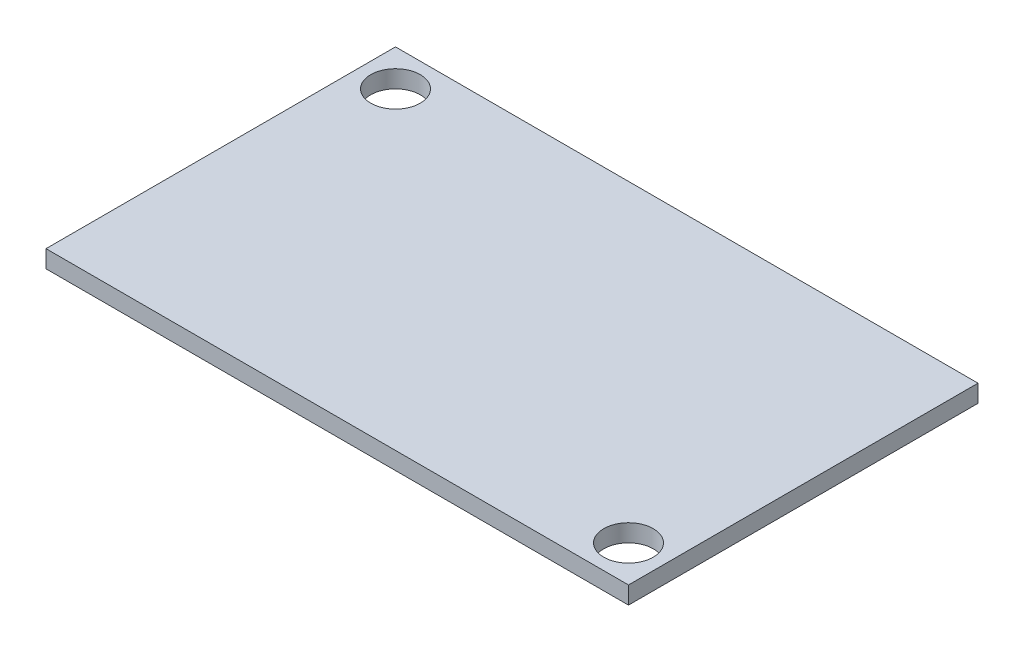
ISO-10303-21;
HEADER;
FILE_DESCRIPTION(('STEP AP214'),'2;1');
FILE_NAME('part.step','',(''),(''),'','','');
FILE_SCHEMA(('AUTOMOTIVE_DESIGN { 1 0 10303 214 1 1 1 1 }'));
ENDSEC;
DATA;
#1=APPLICATION_CONTEXT('core data for automotive mechanical design processes');
#2=APPLICATION_PROTOCOL_DEFINITION('international standard','automotive_design',2000,#1);
#3=PRODUCT_CONTEXT('',#1,'mechanical');
#4=PRODUCT('Part','Part','',(#3));
#5=PRODUCT_RELATED_PRODUCT_CATEGORY('part','',(#4));
#6=PRODUCT_DEFINITION_FORMATION('','',#4);
#7=PRODUCT_DEFINITION_CONTEXT('part definition',#1,'design');
#8=PRODUCT_DEFINITION('design','',#6,#7);
#9=PRODUCT_DEFINITION_SHAPE('','',#8);
#10=(LENGTH_UNIT() NAMED_UNIT(*) SI_UNIT(.MILLI.,.METRE.));
#11=(NAMED_UNIT(*) PLANE_ANGLE_UNIT() SI_UNIT($,.RADIAN.));
#12=(NAMED_UNIT(*) SI_UNIT($,.STERADIAN.) SOLID_ANGLE_UNIT());
#13=UNCERTAINTY_MEASURE_WITH_UNIT(LENGTH_MEASURE(1.E-05),#10,'distance_accuracy_value','');
#14=(GEOMETRIC_REPRESENTATION_CONTEXT(3) GLOBAL_UNCERTAINTY_ASSIGNED_CONTEXT((#13)) GLOBAL_UNIT_ASSIGNED_CONTEXT((#10,
#11,#12)) REPRESENTATION_CONTEXT('',''));
#15=CARTESIAN_POINT('',(0.,0.,0.));
#16=DIRECTION('',(0.,0.,1.));
#17=DIRECTION('',(1.,0.,0.));
#18=AXIS2_PLACEMENT_3D('',#15,#16,#17);
#19=CARTESIAN_POINT('',(-24.7774917250496,1.2,-1.35864833937372));
#20=DIRECTION('',(1.,0.,0.));
#21=DIRECTION('',(0.,0.,-1.));
#22=AXIS2_PLACEMENT_3D('',#19,#20,#21);
#23=PLANE('',#22);
#24=DIRECTION('',(0.,0.,1.));
#25=VECTOR('',#24,1.);
#26=CARTESIAN_POINT('',(-24.7774917250496,0.,-1.35864833937372));
#27=LINE('',#26,#25);
#28=CARTESIAN_POINT('',(-24.7774917250496,0.,-1.35864833937372));
#29=VERTEX_POINT('',#28);
#30=CARTESIAN_POINT('',(-24.7774917250496,0.,22.6413516606263));
#31=VERTEX_POINT('',#30);
#32=EDGE_CURVE('E95',#29,#31,#27,.T.);
#33=ORIENTED_EDGE('',*,*,#32,.T.);
#34=DIRECTION('',(0.,-1.,0.));
#35=VECTOR('',#34,1.);
#36=CARTESIAN_POINT('',(-24.7774917250496,1.2,22.6413516606263));
#37=LINE('',#36,#35);
#38=CARTESIAN_POINT('',(-24.7774917250496,1.2,22.6413516606263));
#39=VERTEX_POINT('',#38);
#40=EDGE_CURVE('E11',#39,#31,#37,.T.);
#41=ORIENTED_EDGE('',*,*,#40,.F.);
#42=DIRECTION('',(0.,0.,1.));
#43=VECTOR('',#42,1.);
#44=CARTESIAN_POINT('',(-24.7774917250496,1.2,-1.35864833937372));
#45=LINE('',#44,#43);
#46=CARTESIAN_POINT('',(-24.7774917250496,1.2,-1.35864833937372));
#47=VERTEX_POINT('',#46);
#48=EDGE_CURVE('E83',#47,#39,#45,.T.);
#49=ORIENTED_EDGE('',*,*,#48,.F.);
#50=DIRECTION('',(0.,-1.,0.));
#51=VECTOR('',#50,1.);
#52=CARTESIAN_POINT('',(-24.7774917250496,1.2,-1.35864833937372));
#53=LINE('',#52,#51);
#54=EDGE_CURVE('E91',#47,#29,#53,.T.);
#55=ORIENTED_EDGE('',*,*,#54,.T.);
#56=EDGE_LOOP('',(#33,#41,#49,#55));
#57=FACE_BOUND('',#56,.T.);
#58=ADVANCED_FACE('F32',(#57),#23,.F.);
#59=CARTESIAN_POINT('',(-24.7774917250496,1.2,22.6413516606263));
#60=DIRECTION('',(0.,0.,-1.));
#61=DIRECTION('',(-1.,0.,0.));
#62=AXIS2_PLACEMENT_3D('',#59,#60,#61);
#63=PLANE('',#62);
#64=DIRECTION('',(1.,0.,0.));
#65=VECTOR('',#64,1.);
#66=CARTESIAN_POINT('',(-24.7774917250496,0.,22.6413516606263));
#67=LINE('',#66,#65);
#68=CARTESIAN_POINT('',(15.2225082749504,0.,22.6413516606263));
#69=VERTEX_POINT('',#68);
#70=EDGE_CURVE('E87',#31,#69,#67,.T.);
#71=ORIENTED_EDGE('',*,*,#70,.T.);
#72=DIRECTION('',(0.,-1.,0.));
#73=VECTOR('',#72,1.);
#74=CARTESIAN_POINT('',(15.2225082749504,1.2,22.6413516606263));
#75=LINE('',#74,#73);
#76=CARTESIAN_POINT('',(15.2225082749504,1.2,22.6413516606263));
#77=VERTEX_POINT('',#76);
#78=EDGE_CURVE('E40',#77,#69,#75,.T.);
#79=ORIENTED_EDGE('',*,*,#78,.F.);
#80=DIRECTION('',(1.,0.,0.));
#81=VECTOR('',#80,1.);
#82=CARTESIAN_POINT('',(-24.7774917250496,1.2,22.6413516606263));
#83=LINE('',#82,#81);
#84=EDGE_CURVE('E78',#39,#77,#83,.T.);
#85=ORIENTED_EDGE('',*,*,#84,.F.);
#86=ORIENTED_EDGE('',*,*,#40,.T.);
#87=EDGE_LOOP('',(#71,#79,#85,#86));
#88=FACE_BOUND('',#87,.T.);
#89=ADVANCED_FACE('F86',(#88),#63,.F.);
#90=CARTESIAN_POINT('',(15.2225082749504,1.2,-1.35864833937372));
#91=DIRECTION('',(-1.,0.,0.));
#92=DIRECTION('',(0.,0.,1.));
#93=AXIS2_PLACEMENT_3D('',#90,#91,#92);
#94=PLANE('',#93);
#95=DIRECTION('',(0.,0.,-1.));
#96=VECTOR('',#95,1.);
#97=CARTESIAN_POINT('',(15.2225082749504,0.,-1.35864833937372));
#98=LINE('',#97,#96);
#99=CARTESIAN_POINT('',(15.2225082749504,0.,-1.35864833937372));
#100=VERTEX_POINT('',#99);
#101=EDGE_CURVE('E65',#69,#100,#98,.T.);
#102=ORIENTED_EDGE('',*,*,#101,.T.);
#103=DIRECTION('',(0.,-1.,0.));
#104=VECTOR('',#103,1.);
#105=CARTESIAN_POINT('',(15.2225082749504,1.2,-1.35864833937372));
#106=LINE('',#105,#104);
#107=CARTESIAN_POINT('',(15.2225082749504,1.2,-1.35864833937372));
#108=VERTEX_POINT('',#107);
#109=EDGE_CURVE('E88',#108,#100,#106,.T.);
#110=ORIENTED_EDGE('',*,*,#109,.F.);
#111=DIRECTION('',(0.,0.,-1.));
#112=VECTOR('',#111,1.);
#113=CARTESIAN_POINT('',(15.2225082749504,1.2,-1.35864833937372));
#114=LINE('',#113,#112);
#115=EDGE_CURVE('E81',#77,#108,#114,.T.);
#116=ORIENTED_EDGE('',*,*,#115,.F.);
#117=ORIENTED_EDGE('',*,*,#78,.T.);
#118=EDGE_LOOP('',(#102,#110,#116,#117));
#119=FACE_BOUND('',#118,.T.);
#120=ADVANCED_FACE('F89',(#119),#94,.F.);
#121=CARTESIAN_POINT('',(-24.7774917250496,1.2,-1.35864833937372));
#122=DIRECTION('',(0.,0.,1.));
#123=DIRECTION('',(1.,0.,0.));
#124=AXIS2_PLACEMENT_3D('',#121,#122,#123);
#125=PLANE('',#124);
#126=DIRECTION('',(-1.,0.,0.));
#127=VECTOR('',#126,1.);
#128=CARTESIAN_POINT('',(-24.7774917250496,0.,-1.35864833937372));
#129=LINE('',#128,#127);
#130=EDGE_CURVE('E71',#100,#29,#129,.T.);
#131=ORIENTED_EDGE('',*,*,#130,.T.);
#132=ORIENTED_EDGE('',*,*,#54,.F.);
#133=DIRECTION('',(-1.,0.,0.));
#134=VECTOR('',#133,1.);
#135=CARTESIAN_POINT('',(-24.7774917250496,1.2,-1.35864833937372));
#136=LINE('',#135,#134);
#137=EDGE_CURVE('E48',#108,#47,#136,.T.);
#138=ORIENTED_EDGE('',*,*,#137,.F.);
#139=ORIENTED_EDGE('',*,*,#109,.T.);
#140=EDGE_LOOP('',(#131,#132,#138,#139));
#141=FACE_BOUND('',#140,.T.);
#142=ADVANCED_FACE('F103',(#141),#125,.F.);
#143=CARTESIAN_POINT('',(0.,1.2,0.));
#144=DIRECTION('',(0.,1.,0.));
#145=DIRECTION('',(0.,0.,1.));
#146=AXIS2_PLACEMENT_3D('',#143,#144,#145);
#147=PLANE('',#146);
#148=CARTESIAN_POINT('',(-22.2774917250496,1.2,1.14135166062628));
#149=DIRECTION('',(0.,1.,0.));
#150=DIRECTION('',(0.,0.,1.));
#151=AXIS2_PLACEMENT_3D('',#148,#149,#150);
#152=CIRCLE('',#151,1.69999999999999);
#153=CARTESIAN_POINT('',(-22.2774917250496,1.2,2.84135166062627));
#154=VERTEX_POINT('',#153);
#155=EDGE_CURVE('E117',#154,#154,#152,.T.);
#156=ORIENTED_EDGE('',*,*,#155,.F.);
#157=EDGE_LOOP('',(#156));
#158=FACE_BOUND('',#157,.T.);
#159=CARTESIAN_POINT('',(12.7225082749504,1.2,20.1413516606263));
#160=DIRECTION('',(0.,1.,0.));
#161=DIRECTION('',(0.,0.,1.));
#162=AXIS2_PLACEMENT_3D('',#159,#160,#161);
#163=CIRCLE('',#162,1.69999999999999);
#164=CARTESIAN_POINT('',(12.7225082749504,1.2,21.8413516606263));
#165=VERTEX_POINT('',#164);
#166=EDGE_CURVE('E111',#165,#165,#163,.T.);
#167=ORIENTED_EDGE('',*,*,#166,.F.);
#168=EDGE_LOOP('',(#167));
#169=FACE_BOUND('',#168,.T.);
#170=ORIENTED_EDGE('',*,*,#48,.T.);
#171=ORIENTED_EDGE('',*,*,#84,.T.);
#172=ORIENTED_EDGE('',*,*,#115,.T.);
#173=ORIENTED_EDGE('',*,*,#137,.T.);
#174=EDGE_LOOP('',(#170,#171,#172,#173));
#175=FACE_BOUND('',#174,.T.);
#176=ADVANCED_FACE('F79',(#158,#169,#175),#147,.T.);
#177=CARTESIAN_POINT('',(0.,0.,0.));
#178=DIRECTION('',(0.,1.,0.));
#179=DIRECTION('',(0.,0.,1.));
#180=AXIS2_PLACEMENT_3D('',#177,#178,#179);
#181=PLANE('',#180);
#182=CARTESIAN_POINT('',(-22.2774917250496,0.,1.14135166062628));
#183=DIRECTION('',(0.,1.,0.));
#184=DIRECTION('',(0.,0.,1.));
#185=AXIS2_PLACEMENT_3D('',#182,#183,#184);
#186=CIRCLE('',#185,1.7);
#187=CARTESIAN_POINT('',(-22.2774917250496,0.,2.84135166062628));
#188=VERTEX_POINT('',#187);
#189=EDGE_CURVE('E114',#188,#188,#186,.T.);
#190=ORIENTED_EDGE('',*,*,#189,.T.);
#191=EDGE_LOOP('',(#190));
#192=FACE_BOUND('',#191,.T.);
#193=CARTESIAN_POINT('',(12.7225082749504,0.,20.1413516606263));
#194=DIRECTION('',(0.,1.,0.));
#195=DIRECTION('',(0.,0.,1.));
#196=AXIS2_PLACEMENT_3D('',#193,#194,#195);
#197=CIRCLE('',#196,1.7);
#198=CARTESIAN_POINT('',(12.7225082749504,0.,21.8413516606263));
#199=VERTEX_POINT('',#198);
#200=EDGE_CURVE('E98',#199,#199,#197,.T.);
#201=ORIENTED_EDGE('',*,*,#200,.T.);
#202=EDGE_LOOP('',(#201));
#203=FACE_BOUND('',#202,.T.);
#204=ORIENTED_EDGE('',*,*,#32,.F.);
#205=ORIENTED_EDGE('',*,*,#130,.F.);
#206=ORIENTED_EDGE('',*,*,#101,.F.);
#207=ORIENTED_EDGE('',*,*,#70,.F.);
#208=EDGE_LOOP('',(#204,#205,#206,#207));
#209=FACE_BOUND('',#208,.T.);
#210=ADVANCED_FACE('F106',(#192,#203,#209),#181,.F.);
#211=CARTESIAN_POINT('',(12.7225082749504,1.2,20.1413516606263));
#212=DIRECTION('',(0.,1.,0.));
#213=DIRECTION('',(0.,0.,1.));
#214=AXIS2_PLACEMENT_3D('',#211,#212,#213);
#215=CYLINDRICAL_SURFACE('',#214,1.69999999999999);
#216=ORIENTED_EDGE('',*,*,#200,.F.);
#217=EDGE_LOOP('',(#216));
#218=FACE_BOUND('',#217,.T.);
#219=ORIENTED_EDGE('',*,*,#166,.T.);
#220=EDGE_LOOP('',(#219));
#221=FACE_BOUND('',#220,.T.);
#222=ADVANCED_FACE('F128',(#218,#221),#215,.F.);
#223=CARTESIAN_POINT('',(-22.2774917250496,1.2,1.14135166062628));
#224=DIRECTION('',(0.,1.,0.));
#225=DIRECTION('',(0.,0.,1.));
#226=AXIS2_PLACEMENT_3D('',#223,#224,#225);
#227=CYLINDRICAL_SURFACE('',#226,1.69999999999999);
#228=ORIENTED_EDGE('',*,*,#189,.F.);
#229=EDGE_LOOP('',(#228));
#230=FACE_BOUND('',#229,.T.);
#231=ORIENTED_EDGE('',*,*,#155,.T.);
#232=EDGE_LOOP('',(#231));
#233=FACE_BOUND('',#232,.T.);
#234=ADVANCED_FACE('F121',(#230,#233),#227,.F.);
#235=CLOSED_SHELL('',(#58,#89,#120,#142,#176,#210,#222,#234));
#236=MANIFOLD_SOLID_BREP('B2',#235);
#237=ADVANCED_BREP_SHAPE_REPRESENTATION('',(#18,#236),#14);
#238=SHAPE_DEFINITION_REPRESENTATION(#9,#237);
ENDSEC;
END-ISO-10303-21;
